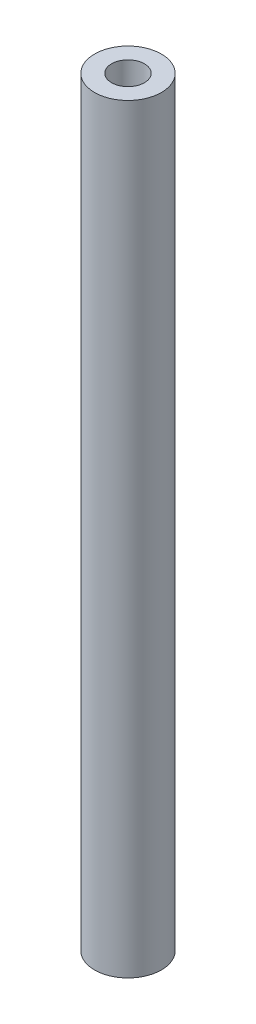
ISO-10303-21;
HEADER;
FILE_DESCRIPTION(('STEP AP214'),'2;1');
FILE_NAME('part.step','',(''),(''),'','','');
FILE_SCHEMA(('AUTOMOTIVE_DESIGN { 1 0 10303 214 1 1 1 1 }'));
ENDSEC;
DATA;
#1=APPLICATION_CONTEXT('core data for automotive mechanical design processes');
#2=APPLICATION_PROTOCOL_DEFINITION('international standard','automotive_design',2000,#1);
#3=PRODUCT_CONTEXT('',#1,'mechanical');
#4=PRODUCT('Part','Part','',(#3));
#5=PRODUCT_RELATED_PRODUCT_CATEGORY('part','',(#4));
#6=PRODUCT_DEFINITION_FORMATION('','',#4);
#7=PRODUCT_DEFINITION_CONTEXT('part definition',#1,'design');
#8=PRODUCT_DEFINITION('design','',#6,#7);
#9=PRODUCT_DEFINITION_SHAPE('','',#8);
#10=(LENGTH_UNIT() NAMED_UNIT(*) SI_UNIT(.MILLI.,.METRE.));
#11=(NAMED_UNIT(*) PLANE_ANGLE_UNIT() SI_UNIT($,.RADIAN.));
#12=(NAMED_UNIT(*) SI_UNIT($,.STERADIAN.) SOLID_ANGLE_UNIT());
#13=UNCERTAINTY_MEASURE_WITH_UNIT(LENGTH_MEASURE(1.E-05),#10,'distance_accuracy_value','');
#14=(GEOMETRIC_REPRESENTATION_CONTEXT(3) GLOBAL_UNCERTAINTY_ASSIGNED_CONTEXT((#13)) GLOBAL_UNIT_ASSIGNED_CONTEXT((#10,
#11,#12)) REPRESENTATION_CONTEXT('',''));
#15=CARTESIAN_POINT('',(0.,0.,0.));
#16=DIRECTION('',(0.,0.,1.));
#17=DIRECTION('',(1.,0.,0.));
#18=AXIS2_PLACEMENT_3D('',#15,#16,#17);
#19=CARTESIAN_POINT('',(0.,74.,0.));
#20=DIRECTION('',(0.,1.,0.));
#21=DIRECTION('',(0.,0.,1.));
#22=AXIS2_PLACEMENT_3D('',#19,#20,#21);
#23=PLANE('',#22);
#24=CARTESIAN_POINT('',(0.,74.,0.));
#25=DIRECTION('',(0.,1.,0.));
#26=DIRECTION('',(0.,0.,1.));
#27=AXIS2_PLACEMENT_3D('',#24,#25,#26);
#28=CIRCLE('',#27,3.25);
#29=CARTESIAN_POINT('',(0.,74.,3.25));
#30=VERTEX_POINT('',#29);
#31=EDGE_CURVE('E10',#30,#30,#28,.T.);
#32=ORIENTED_EDGE('',*,*,#31,.T.);
#33=EDGE_LOOP('',(#32));
#34=FACE_BOUND('',#33,.T.);
#35=CARTESIAN_POINT('',(0.,74.,0.));
#36=DIRECTION('',(0.,1.,0.));
#37=DIRECTION('',(0.,0.,1.));
#38=AXIS2_PLACEMENT_3D('',#35,#36,#37);
#39=CIRCLE('',#38,1.6);
#40=CARTESIAN_POINT('',(0.,74.,1.6));
#41=VERTEX_POINT('',#40);
#42=EDGE_CURVE('E44',#41,#41,#39,.T.);
#43=ORIENTED_EDGE('',*,*,#42,.F.);
#44=EDGE_LOOP('',(#43));
#45=FACE_BOUND('',#44,.T.);
#46=ADVANCED_FACE('F33',(#34,#45),#23,.T.);
#47=CARTESIAN_POINT('',(0.,0.,0.));
#48=DIRECTION('',(0.,1.,0.));
#49=DIRECTION('',(0.,0.,1.));
#50=AXIS2_PLACEMENT_3D('',#47,#48,#49);
#51=PLANE('',#50);
#52=CARTESIAN_POINT('',(0.,0.,0.));
#53=DIRECTION('',(0.,1.,0.));
#54=DIRECTION('',(0.,0.,1.));
#55=AXIS2_PLACEMENT_3D('',#52,#53,#54);
#56=CIRCLE('',#55,3.25);
#57=CARTESIAN_POINT('',(0.,0.,3.25));
#58=VERTEX_POINT('',#57);
#59=EDGE_CURVE('E37',#58,#58,#56,.T.);
#60=ORIENTED_EDGE('',*,*,#59,.F.);
#61=EDGE_LOOP('',(#60));
#62=FACE_BOUND('',#61,.T.);
#63=CARTESIAN_POINT('',(0.,0.,0.));
#64=DIRECTION('',(0.,1.,0.));
#65=DIRECTION('',(0.,0.,1.));
#66=AXIS2_PLACEMENT_3D('',#63,#64,#65);
#67=CIRCLE('',#66,1.6);
#68=CARTESIAN_POINT('',(0.,0.,1.6));
#69=VERTEX_POINT('',#68);
#70=EDGE_CURVE('E46',#69,#69,#67,.T.);
#71=ORIENTED_EDGE('',*,*,#70,.T.);
#72=EDGE_LOOP('',(#71));
#73=FACE_BOUND('',#72,.T.);
#74=ADVANCED_FACE('F56',(#62,#73),#51,.F.);
#75=CARTESIAN_POINT('',(0.,74.,0.));
#76=DIRECTION('',(0.,-1.,0.));
#77=DIRECTION('',(0.,0.,-1.));
#78=AXIS2_PLACEMENT_3D('',#75,#76,#77);
#79=CYLINDRICAL_SURFACE('',#78,3.25);
#80=ORIENTED_EDGE('',*,*,#31,.F.);
#81=EDGE_LOOP('',(#80));
#82=FACE_BOUND('',#81,.T.);
#83=ORIENTED_EDGE('',*,*,#59,.T.);
#84=EDGE_LOOP('',(#83));
#85=FACE_BOUND('',#84,.T.);
#86=ADVANCED_FACE('F35',(#82,#85),#79,.T.);
#87=CARTESIAN_POINT('',(0.,74.,0.));
#88=DIRECTION('',(0.,-1.,0.));
#89=DIRECTION('',(0.,0.,-1.));
#90=AXIS2_PLACEMENT_3D('',#87,#88,#89);
#91=CYLINDRICAL_SURFACE('',#90,1.6);
#92=ORIENTED_EDGE('',*,*,#42,.T.);
#93=EDGE_LOOP('',(#92));
#94=FACE_BOUND('',#93,.T.);
#95=ORIENTED_EDGE('',*,*,#70,.F.);
#96=EDGE_LOOP('',(#95));
#97=FACE_BOUND('',#96,.T.);
#98=ADVANCED_FACE('F52',(#94,#97),#91,.F.);
#99=CLOSED_SHELL('',(#46,#74,#86,#98));
#100=MANIFOLD_SOLID_BREP('B2',#99);
#101=ADVANCED_BREP_SHAPE_REPRESENTATION('',(#18,#100),#14);
#102=SHAPE_DEFINITION_REPRESENTATION(#9,#101);
ENDSEC;
END-ISO-10303-21;
